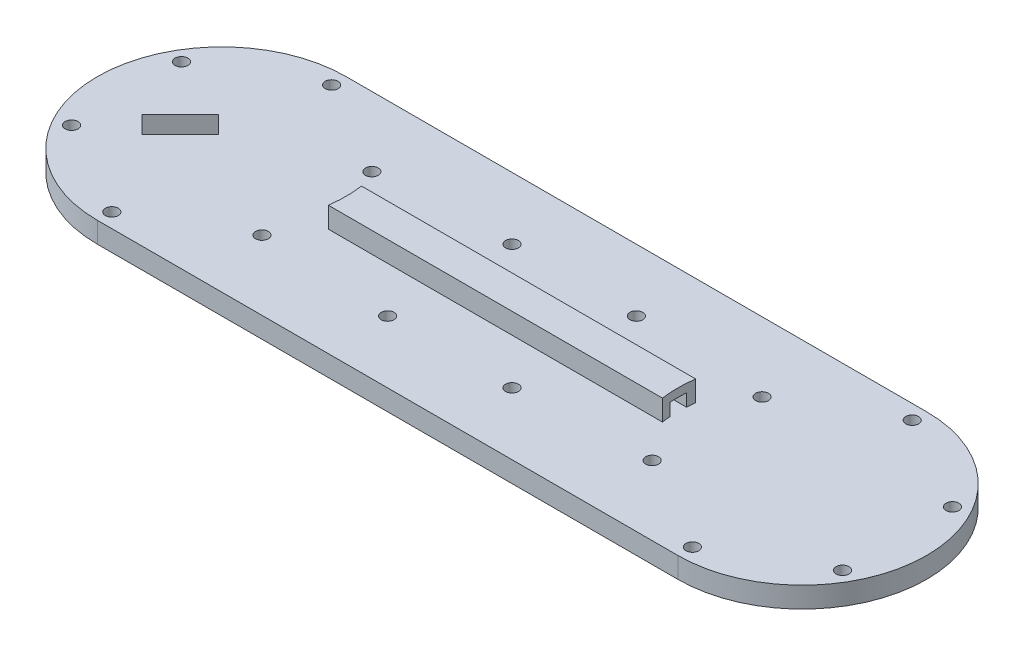
ISO-10303-21;
HEADER;
FILE_DESCRIPTION(('STEP AP214'),'2;1');
FILE_NAME('part.step','',(''),(''),'','','');
FILE_SCHEMA(('AUTOMOTIVE_DESIGN { 1 0 10303 214 1 1 1 1 }'));
ENDSEC;
DATA;
#1=APPLICATION_CONTEXT('core data for automotive mechanical design processes');
#2=APPLICATION_PROTOCOL_DEFINITION('international standard','automotive_design',2000,#1);
#3=PRODUCT_CONTEXT('',#1,'mechanical');
#4=PRODUCT('Part','Part','',(#3));
#5=PRODUCT_RELATED_PRODUCT_CATEGORY('part','',(#4));
#6=PRODUCT_DEFINITION_FORMATION('','',#4);
#7=PRODUCT_DEFINITION_CONTEXT('part definition',#1,'design');
#8=PRODUCT_DEFINITION('design','',#6,#7);
#9=PRODUCT_DEFINITION_SHAPE('','',#8);
#10=(LENGTH_UNIT() NAMED_UNIT(*) SI_UNIT(.MILLI.,.METRE.));
#11=(NAMED_UNIT(*) PLANE_ANGLE_UNIT() SI_UNIT($,.RADIAN.));
#12=(NAMED_UNIT(*) SI_UNIT($,.STERADIAN.) SOLID_ANGLE_UNIT());
#13=UNCERTAINTY_MEASURE_WITH_UNIT(LENGTH_MEASURE(1.E-05),#10,'distance_accuracy_value','');
#14=(GEOMETRIC_REPRESENTATION_CONTEXT(3) GLOBAL_UNCERTAINTY_ASSIGNED_CONTEXT((#13)) GLOBAL_UNIT_ASSIGNED_CONTEXT((#10,
#11,#12)) REPRESENTATION_CONTEXT('',''));
#15=CARTESIAN_POINT('',(0.,0.,0.));
#16=DIRECTION('',(0.,0.,1.));
#17=DIRECTION('',(1.,0.,0.));
#18=AXIS2_PLACEMENT_3D('',#15,#16,#17);
#19=CARTESIAN_POINT('',(70.,5.,0.));
#20=DIRECTION('',(0.,-1.,0.));
#21=DIRECTION('',(0.,0.,-1.));
#22=AXIS2_PLACEMENT_3D('',#19,#20,#21);
#23=PLANE('',#22);
#24=CARTESIAN_POINT('',(-15.,5.,15.));
#25=DIRECTION('',(0.,1.,0.));
#26=DIRECTION('',(0.,0.,1.));
#27=AXIS2_PLACEMENT_3D('',#24,#25,#26);
#28=CIRCLE('',#27,1.55);
#29=CARTESIAN_POINT('',(-15.,5.,16.55));
#30=VERTEX_POINT('',#29);
#31=EDGE_CURVE('E457',#30,#30,#28,.T.);
#32=ORIENTED_EDGE('',*,*,#31,.F.);
#33=EDGE_LOOP('',(#32));
#34=FACE_BOUND('',#33,.T.);
#35=CARTESIAN_POINT('',(-15.,5.,-15.));
#36=DIRECTION('',(0.,1.,0.));
#37=DIRECTION('',(0.,0.,1.));
#38=AXIS2_PLACEMENT_3D('',#35,#36,#37);
#39=CIRCLE('',#38,1.55);
#40=CARTESIAN_POINT('',(-15.,5.,-13.45));
#41=VERTEX_POINT('',#40);
#42=EDGE_CURVE('E463',#41,#41,#39,.T.);
#43=ORIENTED_EDGE('',*,*,#42,.F.);
#44=EDGE_LOOP('',(#43));
#45=FACE_BOUND('',#44,.T.);
#46=CARTESIAN_POINT('',(15.,5.,-15.));
#47=DIRECTION('',(0.,1.,0.));
#48=DIRECTION('',(0.,0.,1.));
#49=AXIS2_PLACEMENT_3D('',#46,#47,#48);
#50=CIRCLE('',#49,1.55);
#51=CARTESIAN_POINT('',(15.,5.,-13.45));
#52=VERTEX_POINT('',#51);
#53=EDGE_CURVE('E469',#52,#52,#50,.T.);
#54=ORIENTED_EDGE('',*,*,#53,.F.);
#55=EDGE_LOOP('',(#54));
#56=FACE_BOUND('',#55,.T.);
#57=CARTESIAN_POINT('',(15.,5.,15.));
#58=DIRECTION('',(0.,1.,0.));
#59=DIRECTION('',(0.,0.,1.));
#60=AXIS2_PLACEMENT_3D('',#57,#58,#59);
#61=CIRCLE('',#60,1.55);
#62=CARTESIAN_POINT('',(15.,5.,16.55));
#63=VERTEX_POINT('',#62);
#64=EDGE_CURVE('E475',#63,#63,#61,.T.);
#65=ORIENTED_EDGE('',*,*,#64,.F.);
#66=EDGE_LOOP('',(#65));
#67=FACE_BOUND('',#66,.T.);
#68=DIRECTION('',(1.,0.,0.));
#69=VECTOR('',#68,1.);
#70=CARTESIAN_POINT('',(-70.,5.,30.));
#71=LINE('',#70,#69);
#72=CARTESIAN_POINT('',(-70.,5.,30.));
#73=VERTEX_POINT('',#72);
#74=CARTESIAN_POINT('',(70.,5.,30.));
#75=VERTEX_POINT('',#74);
#76=EDGE_CURVE('E481',#73,#75,#71,.T.);
#77=ORIENTED_EDGE('',*,*,#76,.T.);
#78=CARTESIAN_POINT('',(70.,5.,0.));
#79=DIRECTION('',(0.,-1.,0.));
#80=DIRECTION('',(0.,0.,-1.));
#81=AXIS2_PLACEMENT_3D('',#78,#79,#80);
#82=CIRCLE('',#81,30.);
#83=CARTESIAN_POINT('',(70.,5.,-30.));
#84=VERTEX_POINT('',#83);
#85=EDGE_CURVE('E483',#84,#75,#82,.T.);
#86=ORIENTED_EDGE('',*,*,#85,.F.);
#87=DIRECTION('',(1.,0.,0.));
#88=VECTOR('',#87,1.);
#89=CARTESIAN_POINT('',(-70.,5.,-30.));
#90=LINE('',#89,#88);
#91=CARTESIAN_POINT('',(-70.,5.,-30.));
#92=VERTEX_POINT('',#91);
#93=EDGE_CURVE('E487',#92,#84,#90,.T.);
#94=ORIENTED_EDGE('',*,*,#93,.F.);
#95=CARTESIAN_POINT('',(-70.,5.,0.));
#96=DIRECTION('',(0.,-1.,0.));
#97=DIRECTION('',(0.,0.,-1.));
#98=AXIS2_PLACEMENT_3D('',#95,#96,#97);
#99=CIRCLE('',#98,30.);
#100=EDGE_CURVE('E490',#73,#92,#99,.T.);
#101=ORIENTED_EDGE('',*,*,#100,.F.);
#102=EDGE_LOOP('',(#77,#86,#94,#101));
#103=FACE_BOUND('',#102,.T.);
#104=CARTESIAN_POINT('',(-92.9496732002877,5.,-13.2499999999999));
#105=DIRECTION('',(0.,1.,0.));
#106=DIRECTION('',(0.,0.,1.));
#107=AXIS2_PLACEMENT_3D('',#104,#105,#106);
#108=CIRCLE('',#107,1.54999999999999);
#109=CARTESIAN_POINT('',(-92.9496732002877,5.,-11.6999999999999));
#110=VERTEX_POINT('',#109);
#111=EDGE_CURVE('E442',#110,#110,#108,.T.);
#112=ORIENTED_EDGE('',*,*,#111,.F.);
#113=EDGE_LOOP('',(#112));
#114=FACE_BOUND('',#113,.T.);
#115=CARTESIAN_POINT('',(70.,5.,-26.5));
#116=DIRECTION('',(0.,1.,0.));
#117=DIRECTION('',(0.,0.,1.));
#118=AXIS2_PLACEMENT_3D('',#115,#116,#117);
#119=CIRCLE('',#118,1.54999999999999);
#120=CARTESIAN_POINT('',(70.,5.,-24.95));
#121=VERTEX_POINT('',#120);
#122=EDGE_CURVE('E391',#121,#121,#119,.T.);
#123=ORIENTED_EDGE('',*,*,#122,.F.);
#124=EDGE_LOOP('',(#123));
#125=FACE_BOUND('',#124,.T.);
#126=CARTESIAN_POINT('',(-92.9496732002876,5.,13.2500000000001));
#127=DIRECTION('',(0.,1.,0.));
#128=DIRECTION('',(0.,0.,1.));
#129=AXIS2_PLACEMENT_3D('',#126,#127,#128);
#130=CIRCLE('',#129,1.54999999999999);
#131=CARTESIAN_POINT('',(-92.9496732002876,5.,14.8000000000001));
#132=VERTEX_POINT('',#131);
#133=EDGE_CURVE('E398',#132,#132,#130,.T.);
#134=ORIENTED_EDGE('',*,*,#133,.F.);
#135=EDGE_LOOP('',(#134));
#136=FACE_BOUND('',#135,.T.);
#137=CARTESIAN_POINT('',(-47.0503267997124,5.,-13.2500000000001));
#138=DIRECTION('',(0.,1.,0.));
#139=DIRECTION('',(0.,0.,1.));
#140=AXIS2_PLACEMENT_3D('',#137,#138,#139);
#141=CIRCLE('',#140,1.55);
#142=CARTESIAN_POINT('',(-47.0503267997124,5.,-11.7000000000001));
#143=VERTEX_POINT('',#142);
#144=EDGE_CURVE('E385',#143,#143,#141,.T.);
#145=ORIENTED_EDGE('',*,*,#144,.F.);
#146=EDGE_LOOP('',(#145));
#147=FACE_BOUND('',#146,.T.);
#148=CARTESIAN_POINT('',(47.0503267997124,5.,13.2500000000001));
#149=DIRECTION('',(0.,1.,0.));
#150=DIRECTION('',(0.,0.,1.));
#151=AXIS2_PLACEMENT_3D('',#148,#149,#150);
#152=CIRCLE('',#151,1.54999999999999);
#153=CARTESIAN_POINT('',(47.0503267997124,5.,14.8000000000001));
#154=VERTEX_POINT('',#153);
#155=EDGE_CURVE('E434',#154,#154,#152,.T.);
#156=ORIENTED_EDGE('',*,*,#155,.F.);
#157=EDGE_LOOP('',(#156));
#158=FACE_BOUND('',#157,.T.);
#159=CARTESIAN_POINT('',(-70.,5.,-26.5));
#160=DIRECTION('',(0.,1.,0.));
#161=DIRECTION('',(0.,0.,1.));
#162=AXIS2_PLACEMENT_3D('',#159,#160,#161);
#163=CIRCLE('',#162,1.54999999999999);
#164=CARTESIAN_POINT('',(-70.,5.,-24.95));
#165=VERTEX_POINT('',#164);
#166=EDGE_CURVE('E427',#165,#165,#163,.T.);
#167=ORIENTED_EDGE('',*,*,#166,.F.);
#168=EDGE_LOOP('',(#167));
#169=FACE_BOUND('',#168,.T.);
#170=CARTESIAN_POINT('',(-47.0503267997123,5.,13.2499999999999));
#171=DIRECTION('',(0.,1.,0.));
#172=DIRECTION('',(0.,0.,1.));
#173=AXIS2_PLACEMENT_3D('',#170,#171,#172);
#174=CIRCLE('',#173,1.55);
#175=CARTESIAN_POINT('',(-47.0503267997123,5.,14.7999999999999));
#176=VERTEX_POINT('',#175);
#177=EDGE_CURVE('E446',#176,#176,#174,.T.);
#178=ORIENTED_EDGE('',*,*,#177,.F.);
#179=EDGE_LOOP('',(#178));
#180=FACE_BOUND('',#179,.T.);
#181=CARTESIAN_POINT('',(-70.,5.,26.5));
#182=DIRECTION('',(0.,1.,0.));
#183=DIRECTION('',(0.,0.,1.));
#184=AXIS2_PLACEMENT_3D('',#181,#182,#183);
#185=CIRCLE('',#184,1.54999999999999);
#186=CARTESIAN_POINT('',(-70.,5.,28.05));
#187=VERTEX_POINT('',#186);
#188=EDGE_CURVE('E439',#187,#187,#185,.T.);
#189=ORIENTED_EDGE('',*,*,#188,.F.);
#190=EDGE_LOOP('',(#189));
#191=FACE_BOUND('',#190,.T.);
#192=CARTESIAN_POINT('',(47.0503267997123,5.,-13.2499999999999));
#193=DIRECTION('',(0.,1.,0.));
#194=DIRECTION('',(0.,0.,1.));
#195=AXIS2_PLACEMENT_3D('',#192,#193,#194);
#196=CIRCLE('',#195,1.54999999999999);
#197=CARTESIAN_POINT('',(47.0503267997123,5.,-11.6999999999999));
#198=VERTEX_POINT('',#197);
#199=EDGE_CURVE('E403',#198,#198,#196,.T.);
#200=ORIENTED_EDGE('',*,*,#199,.F.);
#201=EDGE_LOOP('',(#200));
#202=FACE_BOUND('',#201,.T.);
#203=CARTESIAN_POINT('',(92.9496732002876,5.,-13.2500000000001));
#204=DIRECTION('',(0.,1.,0.));
#205=DIRECTION('',(0.,0.,1.));
#206=AXIS2_PLACEMENT_3D('',#203,#204,#205);
#207=CIRCLE('',#206,1.55000000000001);
#208=CARTESIAN_POINT('',(92.9496732002876,5.,-11.7000000000001));
#209=VERTEX_POINT('',#208);
#210=EDGE_CURVE('E410',#209,#209,#207,.T.);
#211=ORIENTED_EDGE('',*,*,#210,.F.);
#212=EDGE_LOOP('',(#211));
#213=FACE_BOUND('',#212,.T.);
#214=CARTESIAN_POINT('',(92.9496732002877,5.,13.2499999999999));
#215=DIRECTION('',(0.,1.,0.));
#216=DIRECTION('',(0.,0.,1.));
#217=AXIS2_PLACEMENT_3D('',#214,#215,#216);
#218=CIRCLE('',#217,1.55000000000001);
#219=CARTESIAN_POINT('',(92.9496732002877,5.,14.7999999999999));
#220=VERTEX_POINT('',#219);
#221=EDGE_CURVE('E416',#220,#220,#218,.T.);
#222=ORIENTED_EDGE('',*,*,#221,.F.);
#223=EDGE_LOOP('',(#222));
#224=FACE_BOUND('',#223,.T.);
#225=CARTESIAN_POINT('',(70.,5.,26.5));
#226=DIRECTION('',(0.,1.,0.));
#227=DIRECTION('',(0.,0.,1.));
#228=AXIS2_PLACEMENT_3D('',#225,#226,#227);
#229=CIRCLE('',#228,1.54999999999999);
#230=CARTESIAN_POINT('',(70.,5.,28.05));
#231=VERTEX_POINT('',#230);
#232=EDGE_CURVE('E422',#231,#231,#229,.T.);
#233=ORIENTED_EDGE('',*,*,#232,.F.);
#234=EDGE_LOOP('',(#233));
#235=FACE_BOUND('',#234,.T.);
#236=DIRECTION('',(1.,0.,0.));
#237=VECTOR('',#236,1.);
#238=CARTESIAN_POINT('',(-80.,5.,2.));
#239=LINE('',#238,#237);
#240=CARTESIAN_POINT('',(-40.0667409058085,5.,2.));
#241=VERTEX_POINT('',#240);
#242=CARTESIAN_POINT('',(40.0667409058085,5.,2.));
#243=VERTEX_POINT('',#242);
#244=EDGE_CURVE('E328',#241,#243,#239,.T.);
#245=ORIENTED_EDGE('',*,*,#244,.T.);
#246=CARTESIAN_POINT('',(70.,5.,0.));
#247=DIRECTION('',(0.,1.,0.));
#248=DIRECTION('',(0.,0.,1.));
#249=AXIS2_PLACEMENT_3D('',#246,#247,#248);
#250=CIRCLE('',#249,30.);
#251=CARTESIAN_POINT('',(40.267862505363,5.,3.99999999999999));
#252=VERTEX_POINT('',#251);
#253=EDGE_CURVE('E349',#243,#252,#250,.T.);
#254=ORIENTED_EDGE('',*,*,#253,.T.);
#255=DIRECTION('',(-1.,0.,0.));
#256=VECTOR('',#255,1.);
#257=CARTESIAN_POINT('',(0.,5.,4.));
#258=LINE('',#257,#256);
#259=CARTESIAN_POINT('',(-40.267862505363,5.,4.));
#260=VERTEX_POINT('',#259);
#261=EDGE_CURVE('E353',#252,#260,#258,.T.);
#262=ORIENTED_EDGE('',*,*,#261,.T.);
#263=CARTESIAN_POINT('',(-70.,5.,0.));
#264=DIRECTION('',(0.,-1.,0.));
#265=DIRECTION('',(0.,0.,-1.));
#266=AXIS2_PLACEMENT_3D('',#263,#264,#265);
#267=CIRCLE('',#266,30.);
#268=EDGE_CURVE('E368',#241,#260,#267,.T.);
#269=ORIENTED_EDGE('',*,*,#268,.F.);
#270=EDGE_LOOP('',(#245,#254,#262,#269));
#271=FACE_BOUND('',#270,.T.);
#272=CARTESIAN_POINT('',(40.267862505363,5.,-3.99999999999999));
#273=VERTEX_POINT('',#272);
#274=CARTESIAN_POINT('',(40.0667409058085,5.,-2.));
#275=VERTEX_POINT('',#274);
#276=EDGE_CURVE('E363',#273,#275,#250,.T.);
#277=ORIENTED_EDGE('',*,*,#276,.T.);
#278=DIRECTION('',(1.,0.,0.));
#279=VECTOR('',#278,1.);
#280=CARTESIAN_POINT('',(-80.,5.,-2.));
#281=LINE('',#280,#279);
#282=CARTESIAN_POINT('',(-40.0667409058085,5.,-2.));
#283=VERTEX_POINT('',#282);
#284=EDGE_CURVE('E325',#283,#275,#281,.T.);
#285=ORIENTED_EDGE('',*,*,#284,.F.);
#286=CARTESIAN_POINT('',(-40.267862505363,5.,-3.99999999999999));
#287=VERTEX_POINT('',#286);
#288=EDGE_CURVE('E369',#287,#283,#267,.T.);
#289=ORIENTED_EDGE('',*,*,#288,.F.);
#290=DIRECTION('',(-1.,0.,0.));
#291=VECTOR('',#290,1.);
#292=CARTESIAN_POINT('',(0.,5.,-3.99999999999999));
#293=LINE('',#292,#291);
#294=EDGE_CURVE('E366',#273,#287,#293,.T.);
#295=ORIENTED_EDGE('',*,*,#294,.F.);
#296=EDGE_LOOP('',(#277,#285,#289,#295));
#297=FACE_BOUND('',#296,.T.);
#298=DIRECTION('',(0.707106781186547,0.,-0.707106781186548));
#299=VECTOR('',#298,1.);
#300=CARTESIAN_POINT('',(-2.87867965644037,5.,-72.8786796564404));
#301=LINE('',#300,#299);
#302=CARTESIAN_POINT('',(-82.4748737341529,5.,6.7175144212722));
#303=VERTEX_POINT('',#302);
#304=CARTESIAN_POINT('',(-73.2824855787278,5.,-2.47487373415291));
#305=VERTEX_POINT('',#304);
#306=EDGE_CURVE('E322',#303,#305,#301,.T.);
#307=ORIENTED_EDGE('',*,*,#306,.F.);
#308=DIRECTION('',(-0.707106781186556,0.,-0.707106781186539));
#309=VECTOR('',#308,1.);
#310=CARTESIAN_POINT('',(-9.59619407771078,5.,79.5961940777126));
#311=LINE('',#310,#309);
#312=CARTESIAN_POINT('',(-86.7175144212722,5.,2.47487373415298));
#313=VERTEX_POINT('',#312);
#314=EDGE_CURVE('E314',#303,#313,#311,.T.);
#315=ORIENTED_EDGE('',*,*,#314,.T.);
#316=DIRECTION('',(0.707106781186547,0.,-0.707106781186549));
#317=VECTOR('',#316,1.);
#318=CARTESIAN_POINT('',(-7.12132034355986,5.,-77.1213203435596));
#319=LINE('',#318,#317);
#320=CARTESIAN_POINT('',(-77.5251262658471,5.,-6.7175144212722));
#321=VERTEX_POINT('',#320);
#322=EDGE_CURVE('E295',#313,#321,#319,.T.);
#323=ORIENTED_EDGE('',*,*,#322,.T.);
#324=DIRECTION('',(0.707106781186548,0.,0.707106781186547));
#325=VECTOR('',#324,1.);
#326=CARTESIAN_POINT('',(-0.403805922287392,5.,70.4038059222874));
#327=LINE('',#326,#325);
#328=EDGE_CURVE('E319',#321,#305,#327,.T.);
#329=ORIENTED_EDGE('',*,*,#328,.T.);
#330=EDGE_LOOP('',(#307,#315,#323,#329));
#331=FACE_BOUND('',#330,.T.);
#332=ADVANCED_FACE('F177',(#34,#45,#56,#67,#103,#114,#125,#136,#147,#158,#169,#180,#191,#202,
#213,#224,#235,#271,#297,#331),#23,.F.);
#333=CARTESIAN_POINT('',(70.,0.,0.));
#334=DIRECTION('',(0.,-1.,0.));
#335=DIRECTION('',(0.,0.,-1.));
#336=AXIS2_PLACEMENT_3D('',#333,#334,#335);
#337=PLANE('',#336);
#338=CARTESIAN_POINT('',(70.,0.,26.5));
#339=DIRECTION('',(0.,1.,0.));
#340=DIRECTION('',(0.,0.,1.));
#341=AXIS2_PLACEMENT_3D('',#338,#339,#340);
#342=CIRCLE('',#341,1.54999999999999);
#343=CARTESIAN_POINT('',(70.,0.,28.05));
#344=VERTEX_POINT('',#343);
#345=EDGE_CURVE('E394',#344,#344,#342,.T.);
#346=ORIENTED_EDGE('',*,*,#345,.T.);
#347=EDGE_LOOP('',(#346));
#348=FACE_BOUND('',#347,.T.);
#349=CARTESIAN_POINT('',(92.9496732002877,0.,13.2499999999999));
#350=DIRECTION('',(0.,1.,0.));
#351=DIRECTION('',(0.,0.,1.));
#352=AXIS2_PLACEMENT_3D('',#349,#350,#351);
#353=CIRCLE('',#352,1.55000000000001);
#354=CARTESIAN_POINT('',(92.9496732002877,0.,14.7999999999999));
#355=VERTEX_POINT('',#354);
#356=EDGE_CURVE('E419',#355,#355,#353,.T.);
#357=ORIENTED_EDGE('',*,*,#356,.T.);
#358=EDGE_LOOP('',(#357));
#359=FACE_BOUND('',#358,.T.);
#360=CARTESIAN_POINT('',(92.9496732002876,0.,-13.2500000000001));
#361=DIRECTION('',(0.,1.,0.));
#362=DIRECTION('',(0.,0.,1.));
#363=AXIS2_PLACEMENT_3D('',#360,#361,#362);
#364=CIRCLE('',#363,1.55000000000001);
#365=CARTESIAN_POINT('',(92.9496732002876,0.,-11.7000000000001));
#366=VERTEX_POINT('',#365);
#367=EDGE_CURVE('E413',#366,#366,#364,.T.);
#368=ORIENTED_EDGE('',*,*,#367,.T.);
#369=EDGE_LOOP('',(#368));
#370=FACE_BOUND('',#369,.T.);
#371=CARTESIAN_POINT('',(47.0503267997123,0.,-13.2499999999999));
#372=DIRECTION('',(0.,1.,0.));
#373=DIRECTION('',(0.,0.,1.));
#374=AXIS2_PLACEMENT_3D('',#371,#372,#373);
#375=CIRCLE('',#374,1.54999999999999);
#376=CARTESIAN_POINT('',(47.0503267997123,0.,-11.6999999999999));
#377=VERTEX_POINT('',#376);
#378=EDGE_CURVE('E407',#377,#377,#375,.T.);
#379=ORIENTED_EDGE('',*,*,#378,.T.);
#380=EDGE_LOOP('',(#379));
#381=FACE_BOUND('',#380,.T.);
#382=CARTESIAN_POINT('',(-70.,0.,26.5));
#383=DIRECTION('',(0.,1.,0.));
#384=DIRECTION('',(0.,0.,1.));
#385=AXIS2_PLACEMENT_3D('',#382,#383,#384);
#386=CIRCLE('',#385,1.54999999999999);
#387=CARTESIAN_POINT('',(-70.,0.,28.05));
#388=VERTEX_POINT('',#387);
#389=EDGE_CURVE('E443',#388,#388,#386,.T.);
#390=ORIENTED_EDGE('',*,*,#389,.T.);
#391=EDGE_LOOP('',(#390));
#392=FACE_BOUND('',#391,.T.);
#393=CARTESIAN_POINT('',(-47.0503267997123,0.,13.2499999999999));
#394=DIRECTION('',(0.,1.,0.));
#395=DIRECTION('',(0.,0.,1.));
#396=AXIS2_PLACEMENT_3D('',#393,#394,#395);
#397=CIRCLE('',#396,1.55);
#398=CARTESIAN_POINT('',(-47.0503267997123,0.,14.7999999999999));
#399=VERTEX_POINT('',#398);
#400=EDGE_CURVE('E430',#399,#399,#397,.T.);
#401=ORIENTED_EDGE('',*,*,#400,.T.);
#402=EDGE_LOOP('',(#401));
#403=FACE_BOUND('',#402,.T.);
#404=CARTESIAN_POINT('',(-70.,0.,-26.5));
#405=DIRECTION('',(0.,1.,0.));
#406=DIRECTION('',(0.,0.,1.));
#407=AXIS2_PLACEMENT_3D('',#404,#405,#406);
#408=CIRCLE('',#407,1.54999999999999);
#409=CARTESIAN_POINT('',(-70.,0.,-24.95));
#410=VERTEX_POINT('',#409);
#411=EDGE_CURVE('E431',#410,#410,#408,.T.);
#412=ORIENTED_EDGE('',*,*,#411,.T.);
#413=EDGE_LOOP('',(#412));
#414=FACE_BOUND('',#413,.T.);
#415=CARTESIAN_POINT('',(47.0503267997124,0.,13.2500000000001));
#416=DIRECTION('',(0.,1.,0.));
#417=DIRECTION('',(0.,0.,1.));
#418=AXIS2_PLACEMENT_3D('',#415,#416,#417);
#419=CIRCLE('',#418,1.54999999999999);
#420=CARTESIAN_POINT('',(47.0503267997124,0.,14.8000000000001));
#421=VERTEX_POINT('',#420);
#422=EDGE_CURVE('E406',#421,#421,#419,.T.);
#423=ORIENTED_EDGE('',*,*,#422,.T.);
#424=EDGE_LOOP('',(#423));
#425=FACE_BOUND('',#424,.T.);
#426=CARTESIAN_POINT('',(-47.0503267997124,0.,-13.2500000000001));
#427=DIRECTION('',(0.,1.,0.));
#428=DIRECTION('',(0.,0.,1.));
#429=AXIS2_PLACEMENT_3D('',#426,#427,#428);
#430=CIRCLE('',#429,1.55);
#431=CARTESIAN_POINT('',(-47.0503267997124,0.,-11.7000000000001));
#432=VERTEX_POINT('',#431);
#433=EDGE_CURVE('E384',#432,#432,#430,.T.);
#434=ORIENTED_EDGE('',*,*,#433,.T.);
#435=EDGE_LOOP('',(#434));
#436=FACE_BOUND('',#435,.T.);
#437=CARTESIAN_POINT('',(-92.9496732002876,0.,13.2500000000001));
#438=DIRECTION('',(0.,1.,0.));
#439=DIRECTION('',(0.,0.,1.));
#440=AXIS2_PLACEMENT_3D('',#437,#438,#439);
#441=CIRCLE('',#440,1.54999999999999);
#442=CARTESIAN_POINT('',(-92.9496732002876,0.,14.8000000000001));
#443=VERTEX_POINT('',#442);
#444=EDGE_CURVE('E388',#443,#443,#441,.T.);
#445=ORIENTED_EDGE('',*,*,#444,.T.);
#446=EDGE_LOOP('',(#445));
#447=FACE_BOUND('',#446,.T.);
#448=CARTESIAN_POINT('',(70.,0.,-26.5));
#449=DIRECTION('',(0.,1.,0.));
#450=DIRECTION('',(0.,0.,1.));
#451=AXIS2_PLACEMENT_3D('',#448,#449,#450);
#452=CIRCLE('',#451,1.54999999999999);
#453=CARTESIAN_POINT('',(70.,0.,-24.95));
#454=VERTEX_POINT('',#453);
#455=EDGE_CURVE('E395',#454,#454,#452,.T.);
#456=ORIENTED_EDGE('',*,*,#455,.T.);
#457=EDGE_LOOP('',(#456));
#458=FACE_BOUND('',#457,.T.);
#459=CARTESIAN_POINT('',(-92.9496732002877,0.,-13.2499999999999));
#460=DIRECTION('',(0.,1.,0.));
#461=DIRECTION('',(0.,0.,1.));
#462=AXIS2_PLACEMENT_3D('',#459,#460,#461);
#463=CIRCLE('',#462,1.54999999999999);
#464=CARTESIAN_POINT('',(-92.9496732002877,0.,-11.6999999999999));
#465=VERTEX_POINT('',#464);
#466=EDGE_CURVE('E451',#465,#465,#463,.T.);
#467=ORIENTED_EDGE('',*,*,#466,.T.);
#468=EDGE_LOOP('',(#467));
#469=FACE_BOUND('',#468,.T.);
#470=CARTESIAN_POINT('',(-15.,0.,-15.));
#471=DIRECTION('',(0.,1.,0.));
#472=DIRECTION('',(0.,0.,1.));
#473=AXIS2_PLACEMENT_3D('',#470,#471,#472);
#474=CIRCLE('',#473,1.55);
#475=CARTESIAN_POINT('',(-15.,0.,-13.45));
#476=VERTEX_POINT('',#475);
#477=EDGE_CURVE('E460',#476,#476,#474,.T.);
#478=ORIENTED_EDGE('',*,*,#477,.T.);
#479=EDGE_LOOP('',(#478));
#480=FACE_BOUND('',#479,.T.);
#481=CARTESIAN_POINT('',(15.,0.,15.));
#482=DIRECTION('',(0.,1.,0.));
#483=DIRECTION('',(0.,0.,1.));
#484=AXIS2_PLACEMENT_3D('',#481,#482,#483);
#485=CIRCLE('',#484,1.55);
#486=CARTESIAN_POINT('',(15.,0.,16.55));
#487=VERTEX_POINT('',#486);
#488=EDGE_CURVE('E472',#487,#487,#485,.T.);
#489=ORIENTED_EDGE('',*,*,#488,.T.);
#490=EDGE_LOOP('',(#489));
#491=FACE_BOUND('',#490,.T.);
#492=DIRECTION('',(1.,0.,0.));
#493=VECTOR('',#492,1.);
#494=CARTESIAN_POINT('',(-70.,0.,30.));
#495=LINE('',#494,#493);
#496=CARTESIAN_POINT('',(-70.,0.,30.));
#497=VERTEX_POINT('',#496);
#498=CARTESIAN_POINT('',(70.,0.,30.));
#499=VERTEX_POINT('',#498);
#500=EDGE_CURVE('E478',#497,#499,#495,.T.);
#501=ORIENTED_EDGE('',*,*,#500,.F.);
#502=CARTESIAN_POINT('',(-70.,0.,0.));
#503=DIRECTION('',(0.,-1.,0.));
#504=DIRECTION('',(0.,0.,-1.));
#505=AXIS2_PLACEMENT_3D('',#502,#503,#504);
#506=CIRCLE('',#505,30.);
#507=CARTESIAN_POINT('',(-70.,0.,-30.));
#508=VERTEX_POINT('',#507);
#509=EDGE_CURVE('E484',#497,#508,#506,.T.);
#510=ORIENTED_EDGE('',*,*,#509,.T.);
#511=DIRECTION('',(1.,0.,0.));
#512=VECTOR('',#511,1.);
#513=CARTESIAN_POINT('',(-70.,0.,-30.));
#514=LINE('',#513,#512);
#515=CARTESIAN_POINT('',(70.,0.,-30.));
#516=VERTEX_POINT('',#515);
#517=EDGE_CURVE('E499',#508,#516,#514,.T.);
#518=ORIENTED_EDGE('',*,*,#517,.T.);
#519=CARTESIAN_POINT('',(70.,0.,0.));
#520=DIRECTION('',(0.,-1.,0.));
#521=DIRECTION('',(0.,0.,-1.));
#522=AXIS2_PLACEMENT_3D('',#519,#520,#521);
#523=CIRCLE('',#522,30.);
#524=EDGE_CURVE('E496',#516,#499,#523,.T.);
#525=ORIENTED_EDGE('',*,*,#524,.T.);
#526=EDGE_LOOP('',(#501,#510,#518,#525));
#527=FACE_BOUND('',#526,.T.);
#528=CARTESIAN_POINT('',(15.,0.,-15.));
#529=DIRECTION('',(0.,1.,0.));
#530=DIRECTION('',(0.,0.,1.));
#531=AXIS2_PLACEMENT_3D('',#528,#529,#530);
#532=CIRCLE('',#531,1.55);
#533=CARTESIAN_POINT('',(15.,0.,-13.45));
#534=VERTEX_POINT('',#533);
#535=EDGE_CURVE('E466',#534,#534,#532,.T.);
#536=ORIENTED_EDGE('',*,*,#535,.T.);
#537=EDGE_LOOP('',(#536));
#538=FACE_BOUND('',#537,.T.);
#539=CARTESIAN_POINT('',(-15.,0.,15.));
#540=DIRECTION('',(0.,1.,0.));
#541=DIRECTION('',(0.,0.,1.));
#542=AXIS2_PLACEMENT_3D('',#539,#540,#541);
#543=CIRCLE('',#542,1.55);
#544=CARTESIAN_POINT('',(-15.,0.,16.55));
#545=VERTEX_POINT('',#544);
#546=EDGE_CURVE('E454',#545,#545,#543,.T.);
#547=ORIENTED_EDGE('',*,*,#546,.T.);
#548=EDGE_LOOP('',(#547));
#549=FACE_BOUND('',#548,.T.);
#550=DIRECTION('',(-0.707106781186556,0.,-0.707106781186539));
#551=VECTOR('',#550,1.);
#552=CARTESIAN_POINT('',(-82.4748737341529,0.,6.7175144212722));
#553=LINE('',#552,#551);
#554=CARTESIAN_POINT('',(-82.4748737341529,0.,6.71751442127221));
#555=VERTEX_POINT('',#554);
#556=CARTESIAN_POINT('',(-86.7175144212722,0.,2.47487373415296));
#557=VERTEX_POINT('',#556);
#558=EDGE_CURVE('E301',#555,#557,#553,.T.);
#559=ORIENTED_EDGE('',*,*,#558,.F.);
#560=DIRECTION('',(0.707106781186547,0.,-0.707106781186548));
#561=VECTOR('',#560,1.);
#562=CARTESIAN_POINT('',(-77.8786796564403,0.,2.12132034355964));
#563=LINE('',#562,#561);
#564=CARTESIAN_POINT('',(-73.2824855787278,0.,-2.47487373415291));
#565=VERTEX_POINT('',#564);
#566=EDGE_CURVE('E200',#555,#565,#563,.T.);
#567=ORIENTED_EDGE('',*,*,#566,.T.);
#568=DIRECTION('',(0.707106781186548,0.,0.707106781186547));
#569=VECTOR('',#568,1.);
#570=CARTESIAN_POINT('',(-77.5251262658471,0.,-6.7175144212722));
#571=LINE('',#570,#569);
#572=CARTESIAN_POINT('',(-77.5251262658471,0.,-6.7175144212722));
#573=VERTEX_POINT('',#572);
#574=EDGE_CURVE('E307',#573,#565,#571,.T.);
#575=ORIENTED_EDGE('',*,*,#574,.F.);
#576=DIRECTION('',(0.707106781186547,0.,-0.707106781186549));
#577=VECTOR('',#576,1.);
#578=CARTESIAN_POINT('',(-82.1213203435596,0.,-2.12132034355965));
#579=LINE('',#578,#577);
#580=EDGE_CURVE('E292',#557,#573,#579,.T.);
#581=ORIENTED_EDGE('',*,*,#580,.F.);
#582=EDGE_LOOP('',(#559,#567,#575,#581));
#583=FACE_BOUND('',#582,.T.);
#584=ADVANCED_FACE('F305',(#348,#359,#370,#381,#392,#403,#414,#425,#436,#447,#458,#469,#480,
#491,#527,#538,#549,#583),#337,.T.);
#585=CARTESIAN_POINT('',(70.,10.,0.));
#586=DIRECTION('',(0.,-1.,0.));
#587=DIRECTION('',(0.,0.,-1.));
#588=AXIS2_PLACEMENT_3D('',#585,#586,#587);
#589=CYLINDRICAL_SURFACE('',#588,30.);
#590=CARTESIAN_POINT('',(70.,8.,0.));
#591=DIRECTION('',(0.,-1.,0.));
#592=DIRECTION('',(0.,0.,-1.));
#593=AXIS2_PLACEMENT_3D('',#590,#591,#592);
#594=CIRCLE('',#593,30.);
#595=CARTESIAN_POINT('',(40.0667409058085,8.,2.));
#596=VERTEX_POINT('',#595);
#597=CARTESIAN_POINT('',(40.0667409058085,8.,-2.));
#598=VERTEX_POINT('',#597);
#599=EDGE_CURVE('E341',#596,#598,#594,.T.);
#600=ORIENTED_EDGE('',*,*,#599,.T.);
#601=DIRECTION('',(0.,-1.,0.));
#602=VECTOR('',#601,1.);
#603=CARTESIAN_POINT('',(40.0667409058085,10.,-2.));
#604=LINE('',#603,#602);
#605=EDGE_CURVE('E346',#598,#275,#604,.T.);
#606=ORIENTED_EDGE('',*,*,#605,.T.);
#607=ORIENTED_EDGE('',*,*,#276,.F.);
#608=DIRECTION('',(0.,-1.,0.));
#609=VECTOR('',#608,1.);
#610=CARTESIAN_POINT('',(40.267862505363,10.,-3.99999999999999));
#611=LINE('',#610,#609);
#612=CARTESIAN_POINT('',(40.267862505363,10.,-3.99999999999999));
#613=VERTEX_POINT('',#612);
#614=EDGE_CURVE('E379',#613,#273,#611,.T.);
#615=ORIENTED_EDGE('',*,*,#614,.F.);
#616=CARTESIAN_POINT('',(70.,10.,0.));
#617=DIRECTION('',(0.,1.,0.));
#618=DIRECTION('',(0.,0.,1.));
#619=AXIS2_PLACEMENT_3D('',#616,#617,#618);
#620=CIRCLE('',#619,30.);
#621=CARTESIAN_POINT('',(40.267862505363,10.,3.99999999999999));
#622=VERTEX_POINT('',#621);
#623=EDGE_CURVE('E352',#613,#622,#620,.T.);
#624=ORIENTED_EDGE('',*,*,#623,.T.);
#625=DIRECTION('',(0.,-1.,0.));
#626=VECTOR('',#625,1.);
#627=CARTESIAN_POINT('',(40.267862505363,10.,3.99999999999999));
#628=LINE('',#627,#626);
#629=EDGE_CURVE('E381',#622,#252,#628,.T.);
#630=ORIENTED_EDGE('',*,*,#629,.T.);
#631=ORIENTED_EDGE('',*,*,#253,.F.);
#632=DIRECTION('',(0.,-1.,0.));
#633=VECTOR('',#632,1.);
#634=CARTESIAN_POINT('',(40.0667409058085,10.,2.));
#635=LINE('',#634,#633);
#636=EDGE_CURVE('E337',#596,#243,#635,.T.);
#637=ORIENTED_EDGE('',*,*,#636,.F.);
#638=EDGE_LOOP('',(#600,#606,#607,#615,#624,#630,#631,#637));
#639=FACE_BOUND('',#638,.T.);
#640=ADVANCED_FACE('F532',(#639),#589,.F.);
#641=CARTESIAN_POINT('',(-70.,10.,0.));
#642=DIRECTION('',(0.,-1.,0.));
#643=DIRECTION('',(0.,0.,-1.));
#644=AXIS2_PLACEMENT_3D('',#641,#642,#643);
#645=CYLINDRICAL_SURFACE('',#644,30.);
#646=DIRECTION('',(0.,-1.,0.));
#647=VECTOR('',#646,1.);
#648=CARTESIAN_POINT('',(-40.0667409058085,10.,-2.));
#649=LINE('',#648,#647);
#650=CARTESIAN_POINT('',(-40.0667409058085,8.,-2.));
#651=VERTEX_POINT('',#650);
#652=EDGE_CURVE('E344',#651,#283,#649,.T.);
#653=ORIENTED_EDGE('',*,*,#652,.F.);
#654=CARTESIAN_POINT('',(-70.,8.,0.));
#655=DIRECTION('',(0.,-1.,0.));
#656=DIRECTION('',(0.,0.,-1.));
#657=AXIS2_PLACEMENT_3D('',#654,#655,#656);
#658=CIRCLE('',#657,30.);
#659=CARTESIAN_POINT('',(-40.0667409058085,8.,2.));
#660=VERTEX_POINT('',#659);
#661=EDGE_CURVE('E339',#660,#651,#658,.F.);
#662=ORIENTED_EDGE('',*,*,#661,.F.);
#663=DIRECTION('',(0.,-1.,0.));
#664=VECTOR('',#663,1.);
#665=CARTESIAN_POINT('',(-40.0667409058085,10.,2.));
#666=LINE('',#665,#664);
#667=EDGE_CURVE('E327',#660,#241,#666,.T.);
#668=ORIENTED_EDGE('',*,*,#667,.T.);
#669=ORIENTED_EDGE('',*,*,#268,.T.);
#670=DIRECTION('',(0.,-1.,0.));
#671=VECTOR('',#670,1.);
#672=CARTESIAN_POINT('',(-40.267862505363,10.,4.));
#673=LINE('',#672,#671);
#674=CARTESIAN_POINT('',(-40.267862505363,10.,4.));
#675=VERTEX_POINT('',#674);
#676=EDGE_CURVE('E362',#675,#260,#673,.T.);
#677=ORIENTED_EDGE('',*,*,#676,.F.);
#678=CARTESIAN_POINT('',(-70.,10.,0.));
#679=DIRECTION('',(0.,-1.,0.));
#680=DIRECTION('',(0.,0.,-1.));
#681=AXIS2_PLACEMENT_3D('',#678,#679,#680);
#682=CIRCLE('',#681,30.);
#683=CARTESIAN_POINT('',(-40.267862505363,10.,-3.99999999999999));
#684=VERTEX_POINT('',#683);
#685=EDGE_CURVE('E359',#684,#675,#682,.T.);
#686=ORIENTED_EDGE('',*,*,#685,.F.);
#687=DIRECTION('',(0.,-1.,0.));
#688=VECTOR('',#687,1.);
#689=CARTESIAN_POINT('',(-40.267862505363,10.,-3.99999999999999));
#690=LINE('',#689,#688);
#691=EDGE_CURVE('E376',#684,#287,#690,.T.);
#692=ORIENTED_EDGE('',*,*,#691,.T.);
#693=ORIENTED_EDGE('',*,*,#288,.T.);
#694=EDGE_LOOP('',(#653,#662,#668,#669,#677,#686,#692,#693));
#695=FACE_BOUND('',#694,.T.);
#696=ADVANCED_FACE('F527',(#695),#645,.F.);
#697=CARTESIAN_POINT('',(-70.,5.,30.));
#698=DIRECTION('',(0.,0.,-1.));
#699=DIRECTION('',(-1.,0.,0.));
#700=AXIS2_PLACEMENT_3D('',#697,#698,#699);
#701=PLANE('',#700);
#702=ORIENTED_EDGE('',*,*,#500,.T.);
#703=DIRECTION('',(0.,-1.,0.));
#704=VECTOR('',#703,1.);
#705=CARTESIAN_POINT('',(70.,5.,30.));
#706=LINE('',#705,#704);
#707=EDGE_CURVE('E12',#75,#499,#706,.T.);
#708=ORIENTED_EDGE('',*,*,#707,.F.);
#709=ORIENTED_EDGE('',*,*,#76,.F.);
#710=DIRECTION('',(0.,-1.,0.));
#711=VECTOR('',#710,1.);
#712=CARTESIAN_POINT('',(-70.,5.,30.));
#713=LINE('',#712,#711);
#714=EDGE_CURVE('E493',#73,#497,#713,.T.);
#715=ORIENTED_EDGE('',*,*,#714,.T.);
#716=EDGE_LOOP('',(#702,#708,#709,#715));
#717=FACE_BOUND('',#716,.T.);
#718=ADVANCED_FACE('F179',(#717),#701,.F.);
#719=CARTESIAN_POINT('',(70.,5.,0.));
#720=DIRECTION('',(0.,-1.,0.));
#721=DIRECTION('',(0.,0.,-1.));
#722=AXIS2_PLACEMENT_3D('',#719,#720,#721);
#723=CYLINDRICAL_SURFACE('',#722,30.);
#724=ORIENTED_EDGE('',*,*,#524,.F.);
#725=DIRECTION('',(0.,-1.,0.));
#726=VECTOR('',#725,1.);
#727=CARTESIAN_POINT('',(70.,5.,-30.));
#728=LINE('',#727,#726);
#729=EDGE_CURVE('E185',#84,#516,#728,.T.);
#730=ORIENTED_EDGE('',*,*,#729,.F.);
#731=ORIENTED_EDGE('',*,*,#85,.T.);
#732=ORIENTED_EDGE('',*,*,#707,.T.);
#733=EDGE_LOOP('',(#724,#730,#731,#732));
#734=FACE_BOUND('',#733,.T.);
#735=ADVANCED_FACE('F513',(#734),#723,.T.);
#736=CARTESIAN_POINT('',(-70.,5.,-30.));
#737=DIRECTION('',(0.,0.,-1.));
#738=DIRECTION('',(-1.,0.,0.));
#739=AXIS2_PLACEMENT_3D('',#736,#737,#738);
#740=PLANE('',#739);
#741=ORIENTED_EDGE('',*,*,#517,.F.);
#742=DIRECTION('',(0.,-1.,0.));
#743=VECTOR('',#742,1.);
#744=CARTESIAN_POINT('',(-70.,5.,-30.));
#745=LINE('',#744,#743);
#746=EDGE_CURVE('E505',#92,#508,#745,.T.);
#747=ORIENTED_EDGE('',*,*,#746,.F.);
#748=ORIENTED_EDGE('',*,*,#93,.T.);
#749=ORIENTED_EDGE('',*,*,#729,.T.);
#750=EDGE_LOOP('',(#741,#747,#748,#749));
#751=FACE_BOUND('',#750,.T.);
#752=ADVANCED_FACE('F509',(#751),#740,.T.);
#753=CARTESIAN_POINT('',(-70.,5.,0.));
#754=DIRECTION('',(0.,-1.,0.));
#755=DIRECTION('',(0.,0.,-1.));
#756=AXIS2_PLACEMENT_3D('',#753,#754,#755);
#757=CYLINDRICAL_SURFACE('',#756,30.);
#758=ORIENTED_EDGE('',*,*,#509,.F.);
#759=ORIENTED_EDGE('',*,*,#714,.F.);
#760=ORIENTED_EDGE('',*,*,#100,.T.);
#761=ORIENTED_EDGE('',*,*,#746,.T.);
#762=EDGE_LOOP('',(#758,#759,#760,#761));
#763=FACE_BOUND('',#762,.T.);
#764=ADVANCED_FACE('F520',(#763),#757,.T.);
#765=CARTESIAN_POINT('',(15.,5.,15.));
#766=DIRECTION('',(0.,-1.,0.));
#767=DIRECTION('',(0.,0.,-1.));
#768=AXIS2_PLACEMENT_3D('',#765,#766,#767);
#769=CYLINDRICAL_SURFACE('',#768,1.55);
#770=ORIENTED_EDGE('',*,*,#64,.T.);
#771=EDGE_LOOP('',(#770));
#772=FACE_BOUND('',#771,.T.);
#773=ORIENTED_EDGE('',*,*,#488,.F.);
#774=EDGE_LOOP('',(#773));
#775=FACE_BOUND('',#774,.T.);
#776=ADVANCED_FACE('F546',(#772,#775),#769,.F.);
#777=CARTESIAN_POINT('',(15.,5.,-15.));
#778=DIRECTION('',(0.,-1.,0.));
#779=DIRECTION('',(0.,0.,-1.));
#780=AXIS2_PLACEMENT_3D('',#777,#778,#779);
#781=CYLINDRICAL_SURFACE('',#780,1.55);
#782=ORIENTED_EDGE('',*,*,#53,.T.);
#783=EDGE_LOOP('',(#782));
#784=FACE_BOUND('',#783,.T.);
#785=ORIENTED_EDGE('',*,*,#535,.F.);
#786=EDGE_LOOP('',(#785));
#787=FACE_BOUND('',#786,.T.);
#788=ADVANCED_FACE('F566',(#784,#787),#781,.F.);
#789=CARTESIAN_POINT('',(-15.,5.,-15.));
#790=DIRECTION('',(0.,-1.,0.));
#791=DIRECTION('',(0.,0.,-1.));
#792=AXIS2_PLACEMENT_3D('',#789,#790,#791);
#793=CYLINDRICAL_SURFACE('',#792,1.55);
#794=ORIENTED_EDGE('',*,*,#42,.T.);
#795=EDGE_LOOP('',(#794));
#796=FACE_BOUND('',#795,.T.);
#797=ORIENTED_EDGE('',*,*,#477,.F.);
#798=EDGE_LOOP('',(#797));
#799=FACE_BOUND('',#798,.T.);
#800=ADVANCED_FACE('F573',(#796,#799),#793,.F.);
#801=CARTESIAN_POINT('',(-15.,5.,15.));
#802=DIRECTION('',(0.,-1.,0.));
#803=DIRECTION('',(0.,0.,-1.));
#804=AXIS2_PLACEMENT_3D('',#801,#802,#803);
#805=CYLINDRICAL_SURFACE('',#804,1.55);
#806=ORIENTED_EDGE('',*,*,#31,.T.);
#807=EDGE_LOOP('',(#806));
#808=FACE_BOUND('',#807,.T.);
#809=ORIENTED_EDGE('',*,*,#546,.F.);
#810=EDGE_LOOP('',(#809));
#811=FACE_BOUND('',#810,.T.);
#812=ADVANCED_FACE('F580',(#808,#811),#805,.F.);
#813=CARTESIAN_POINT('',(-92.9496732002877,0.,-13.2499999999999));
#814=DIRECTION('',(0.,1.,0.));
#815=DIRECTION('',(0.,0.,1.));
#816=AXIS2_PLACEMENT_3D('',#813,#814,#815);
#817=CYLINDRICAL_SURFACE('',#816,1.54999999999999);
#818=ORIENTED_EDGE('',*,*,#466,.F.);
#819=EDGE_LOOP('',(#818));
#820=FACE_BOUND('',#819,.T.);
#821=ORIENTED_EDGE('',*,*,#111,.T.);
#822=EDGE_LOOP('',(#821));
#823=FACE_BOUND('',#822,.T.);
#824=ADVANCED_FACE('F588',(#820,#823),#817,.F.);
#825=CARTESIAN_POINT('',(70.,0.,-26.5));
#826=DIRECTION('',(0.,1.,0.));
#827=DIRECTION('',(0.,0.,1.));
#828=AXIS2_PLACEMENT_3D('',#825,#826,#827);
#829=CYLINDRICAL_SURFACE('',#828,1.54999999999999);
#830=ORIENTED_EDGE('',*,*,#455,.F.);
#831=EDGE_LOOP('',(#830));
#832=FACE_BOUND('',#831,.T.);
#833=ORIENTED_EDGE('',*,*,#122,.T.);
#834=EDGE_LOOP('',(#833));
#835=FACE_BOUND('',#834,.T.);
#836=ADVANCED_FACE('F596',(#832,#835),#829,.F.);
#837=CARTESIAN_POINT('',(-92.9496732002876,0.,13.2500000000001));
#838=DIRECTION('',(0.,1.,0.));
#839=DIRECTION('',(0.,0.,1.));
#840=AXIS2_PLACEMENT_3D('',#837,#838,#839);
#841=CYLINDRICAL_SURFACE('',#840,1.54999999999999);
#842=ORIENTED_EDGE('',*,*,#444,.F.);
#843=EDGE_LOOP('',(#842));
#844=FACE_BOUND('',#843,.T.);
#845=ORIENTED_EDGE('',*,*,#133,.T.);
#846=EDGE_LOOP('',(#845));
#847=FACE_BOUND('',#846,.T.);
#848=ADVANCED_FACE('F604',(#844,#847),#841,.F.);
#849=CARTESIAN_POINT('',(-47.0503267997124,0.,-13.2500000000001));
#850=DIRECTION('',(0.,1.,0.));
#851=DIRECTION('',(0.,0.,1.));
#852=AXIS2_PLACEMENT_3D('',#849,#850,#851);
#853=CYLINDRICAL_SURFACE('',#852,1.55);
#854=ORIENTED_EDGE('',*,*,#433,.F.);
#855=EDGE_LOOP('',(#854));
#856=FACE_BOUND('',#855,.T.);
#857=ORIENTED_EDGE('',*,*,#144,.T.);
#858=EDGE_LOOP('',(#857));
#859=FACE_BOUND('',#858,.T.);
#860=ADVANCED_FACE('F612',(#856,#859),#853,.F.);
#861=CARTESIAN_POINT('',(47.0503267997124,0.,13.2500000000001));
#862=DIRECTION('',(0.,1.,0.));
#863=DIRECTION('',(0.,0.,1.));
#864=AXIS2_PLACEMENT_3D('',#861,#862,#863);
#865=CYLINDRICAL_SURFACE('',#864,1.54999999999999);
#866=ORIENTED_EDGE('',*,*,#422,.F.);
#867=EDGE_LOOP('',(#866));
#868=FACE_BOUND('',#867,.T.);
#869=ORIENTED_EDGE('',*,*,#155,.T.);
#870=EDGE_LOOP('',(#869));
#871=FACE_BOUND('',#870,.T.);
#872=ADVANCED_FACE('F620',(#868,#871),#865,.F.);
#873=CARTESIAN_POINT('',(-70.,0.,-26.5));
#874=DIRECTION('',(0.,1.,0.));
#875=DIRECTION('',(0.,0.,1.));
#876=AXIS2_PLACEMENT_3D('',#873,#874,#875);
#877=CYLINDRICAL_SURFACE('',#876,1.54999999999999);
#878=ORIENTED_EDGE('',*,*,#411,.F.);
#879=EDGE_LOOP('',(#878));
#880=FACE_BOUND('',#879,.T.);
#881=ORIENTED_EDGE('',*,*,#166,.T.);
#882=EDGE_LOOP('',(#881));
#883=FACE_BOUND('',#882,.T.);
#884=ADVANCED_FACE('F628',(#880,#883),#877,.F.);
#885=CARTESIAN_POINT('',(-47.0503267997123,0.,13.2499999999999));
#886=DIRECTION('',(0.,1.,0.));
#887=DIRECTION('',(0.,0.,1.));
#888=AXIS2_PLACEMENT_3D('',#885,#886,#887);
#889=CYLINDRICAL_SURFACE('',#888,1.55);
#890=ORIENTED_EDGE('',*,*,#400,.F.);
#891=EDGE_LOOP('',(#890));
#892=FACE_BOUND('',#891,.T.);
#893=ORIENTED_EDGE('',*,*,#177,.T.);
#894=EDGE_LOOP('',(#893));
#895=FACE_BOUND('',#894,.T.);
#896=ADVANCED_FACE('F636',(#892,#895),#889,.F.);
#897=CARTESIAN_POINT('',(-70.,0.,26.5));
#898=DIRECTION('',(0.,1.,0.));
#899=DIRECTION('',(0.,0.,1.));
#900=AXIS2_PLACEMENT_3D('',#897,#898,#899);
#901=CYLINDRICAL_SURFACE('',#900,1.54999999999999);
#902=ORIENTED_EDGE('',*,*,#389,.F.);
#903=EDGE_LOOP('',(#902));
#904=FACE_BOUND('',#903,.T.);
#905=ORIENTED_EDGE('',*,*,#188,.T.);
#906=EDGE_LOOP('',(#905));
#907=FACE_BOUND('',#906,.T.);
#908=ADVANCED_FACE('F644',(#904,#907),#901,.F.);
#909=CARTESIAN_POINT('',(47.0503267997123,0.,-13.2499999999999));
#910=DIRECTION('',(0.,1.,0.));
#911=DIRECTION('',(0.,0.,1.));
#912=AXIS2_PLACEMENT_3D('',#909,#910,#911);
#913=CYLINDRICAL_SURFACE('',#912,1.54999999999999);
#914=ORIENTED_EDGE('',*,*,#378,.F.);
#915=EDGE_LOOP('',(#914));
#916=FACE_BOUND('',#915,.T.);
#917=ORIENTED_EDGE('',*,*,#199,.T.);
#918=EDGE_LOOP('',(#917));
#919=FACE_BOUND('',#918,.T.);
#920=ADVANCED_FACE('F652',(#916,#919),#913,.F.);
#921=CARTESIAN_POINT('',(92.9496732002876,0.,-13.2500000000001));
#922=DIRECTION('',(0.,1.,0.));
#923=DIRECTION('',(0.,0.,1.));
#924=AXIS2_PLACEMENT_3D('',#921,#922,#923);
#925=CYLINDRICAL_SURFACE('',#924,1.55000000000001);
#926=ORIENTED_EDGE('',*,*,#367,.F.);
#927=EDGE_LOOP('',(#926));
#928=FACE_BOUND('',#927,.T.);
#929=ORIENTED_EDGE('',*,*,#210,.T.);
#930=EDGE_LOOP('',(#929));
#931=FACE_BOUND('',#930,.T.);
#932=ADVANCED_FACE('F660',(#928,#931),#925,.F.);
#933=CARTESIAN_POINT('',(92.9496732002877,0.,13.2499999999999));
#934=DIRECTION('',(0.,1.,0.));
#935=DIRECTION('',(0.,0.,1.));
#936=AXIS2_PLACEMENT_3D('',#933,#934,#935);
#937=CYLINDRICAL_SURFACE('',#936,1.55000000000001);
#938=ORIENTED_EDGE('',*,*,#356,.F.);
#939=EDGE_LOOP('',(#938));
#940=FACE_BOUND('',#939,.T.);
#941=ORIENTED_EDGE('',*,*,#221,.T.);
#942=EDGE_LOOP('',(#941));
#943=FACE_BOUND('',#942,.T.);
#944=ADVANCED_FACE('F668',(#940,#943),#937,.F.);
#945=CARTESIAN_POINT('',(70.,0.,26.5));
#946=DIRECTION('',(0.,1.,0.));
#947=DIRECTION('',(0.,0.,1.));
#948=AXIS2_PLACEMENT_3D('',#945,#946,#947);
#949=CYLINDRICAL_SURFACE('',#948,1.54999999999999);
#950=ORIENTED_EDGE('',*,*,#345,.F.);
#951=EDGE_LOOP('',(#950));
#952=FACE_BOUND('',#951,.T.);
#953=ORIENTED_EDGE('',*,*,#232,.T.);
#954=EDGE_LOOP('',(#953));
#955=FACE_BOUND('',#954,.T.);
#956=ADVANCED_FACE('F676',(#952,#955),#949,.F.);
#957=CARTESIAN_POINT('',(0.,10.,-3.99999999999999));
#958=DIRECTION('',(0.,0.,1.));
#959=DIRECTION('',(1.,0.,0.));
#960=AXIS2_PLACEMENT_3D('',#957,#958,#959);
#961=PLANE('',#960);
#962=ORIENTED_EDGE('',*,*,#294,.T.);
#963=ORIENTED_EDGE('',*,*,#691,.F.);
#964=DIRECTION('',(1.,0.,0.));
#965=VECTOR('',#964,1.);
#966=CARTESIAN_POINT('',(0.,10.,-3.99999999999999));
#967=LINE('',#966,#965);
#968=EDGE_CURVE('E356',#684,#613,#967,.T.);
#969=ORIENTED_EDGE('',*,*,#968,.T.);
#970=ORIENTED_EDGE('',*,*,#614,.T.);
#971=EDGE_LOOP('',(#962,#963,#969,#970));
#972=FACE_BOUND('',#971,.T.);
#973=ADVANCED_FACE('F684',(#972),#961,.F.);
#974=CARTESIAN_POINT('',(0.,10.,4.));
#975=DIRECTION('',(0.,0.,1.));
#976=DIRECTION('',(1.,0.,0.));
#977=AXIS2_PLACEMENT_3D('',#974,#975,#976);
#978=PLANE('',#977);
#979=ORIENTED_EDGE('',*,*,#261,.F.);
#980=ORIENTED_EDGE('',*,*,#629,.F.);
#981=DIRECTION('',(1.,0.,0.));
#982=VECTOR('',#981,1.);
#983=CARTESIAN_POINT('',(0.,10.,4.));
#984=LINE('',#983,#982);
#985=EDGE_CURVE('E350',#675,#622,#984,.T.);
#986=ORIENTED_EDGE('',*,*,#985,.F.);
#987=ORIENTED_EDGE('',*,*,#676,.T.);
#988=EDGE_LOOP('',(#979,#980,#986,#987));
#989=FACE_BOUND('',#988,.T.);
#990=ADVANCED_FACE('F692',(#989),#978,.T.);
#991=CARTESIAN_POINT('',(70.,10.,0.));
#992=DIRECTION('',(0.,1.,0.));
#993=DIRECTION('',(0.,0.,1.));
#994=AXIS2_PLACEMENT_3D('',#991,#992,#993);
#995=PLANE('',#994);
#996=ORIENTED_EDGE('',*,*,#985,.T.);
#997=ORIENTED_EDGE('',*,*,#623,.F.);
#998=ORIENTED_EDGE('',*,*,#968,.F.);
#999=ORIENTED_EDGE('',*,*,#685,.T.);
#1000=EDGE_LOOP('',(#996,#997,#998,#999));
#1001=FACE_BOUND('',#1000,.T.);
#1002=ADVANCED_FACE('F700',(#1001),#995,.T.);
#1003=CARTESIAN_POINT('',(-80.,0.,-2.));
#1004=DIRECTION('',(0.,0.,1.));
#1005=DIRECTION('',(1.,0.,0.));
#1006=AXIS2_PLACEMENT_3D('',#1003,#1004,#1005);
#1007=PLANE('',#1006);
#1008=DIRECTION('',(1.,0.,0.));
#1009=VECTOR('',#1008,1.);
#1010=CARTESIAN_POINT('',(-80.,8.,-2.));
#1011=LINE('',#1010,#1009);
#1012=EDGE_CURVE('E324',#651,#598,#1011,.T.);
#1013=ORIENTED_EDGE('',*,*,#1012,.F.);
#1014=ORIENTED_EDGE('',*,*,#652,.T.);
#1015=ORIENTED_EDGE('',*,*,#284,.T.);
#1016=ORIENTED_EDGE('',*,*,#605,.F.);
#1017=EDGE_LOOP('',(#1013,#1014,#1015,#1016));
#1018=FACE_BOUND('',#1017,.T.);
#1019=ADVANCED_FACE('F708',(#1018),#1007,.T.);
#1020=CARTESIAN_POINT('',(-80.,8.,0.));
#1021=DIRECTION('',(0.,-1.,0.));
#1022=DIRECTION('',(0.,0.,-1.));
#1023=AXIS2_PLACEMENT_3D('',#1020,#1021,#1022);
#1024=PLANE('',#1023);
#1025=DIRECTION('',(1.,0.,0.));
#1026=VECTOR('',#1025,1.);
#1027=CARTESIAN_POINT('',(-80.,8.,2.));
#1028=LINE('',#1027,#1026);
#1029=EDGE_CURVE('E331',#660,#596,#1028,.T.);
#1030=ORIENTED_EDGE('',*,*,#1029,.F.);
#1031=ORIENTED_EDGE('',*,*,#661,.T.);
#1032=ORIENTED_EDGE('',*,*,#1012,.T.);
#1033=ORIENTED_EDGE('',*,*,#599,.F.);
#1034=EDGE_LOOP('',(#1030,#1031,#1032,#1033));
#1035=FACE_BOUND('',#1034,.T.);
#1036=ADVANCED_FACE('F717',(#1035),#1024,.T.);
#1037=CARTESIAN_POINT('',(-80.,0.,2.));
#1038=DIRECTION('',(0.,0.,1.));
#1039=DIRECTION('',(0.,-1.,0.));
#1040=AXIS2_PLACEMENT_3D('',#1037,#1038,#1039);
#1041=PLANE('',#1040);
#1042=ORIENTED_EDGE('',*,*,#636,.T.);
#1043=ORIENTED_EDGE('',*,*,#244,.F.);
#1044=ORIENTED_EDGE('',*,*,#667,.F.);
#1045=ORIENTED_EDGE('',*,*,#1029,.T.);
#1046=EDGE_LOOP('',(#1042,#1043,#1044,#1045));
#1047=FACE_BOUND('',#1046,.T.);
#1048=ADVANCED_FACE('F726',(#1047),#1041,.F.);
#1049=CARTESIAN_POINT('',(-77.8786796564403,10.,2.12132034355964));
#1050=DIRECTION('',(-0.707106781186548,0.,-0.707106781186547));
#1051=DIRECTION('',(-0.707106781186547,0.,0.707106781186548));
#1052=AXIS2_PLACEMENT_3D('',#1049,#1050,#1051);
#1053=PLANE('',#1052);
#1054=ORIENTED_EDGE('',*,*,#306,.T.);
#1055=DIRECTION('',(0.,-1.,0.));
#1056=VECTOR('',#1055,1.);
#1057=CARTESIAN_POINT('',(-73.2824855787278,10.,-2.47487373415291));
#1058=LINE('',#1057,#1056);
#1059=EDGE_CURVE('E312',#305,#565,#1058,.T.);
#1060=ORIENTED_EDGE('',*,*,#1059,.T.);
#1061=ORIENTED_EDGE('',*,*,#566,.F.);
#1062=DIRECTION('',(0.,-1.,0.));
#1063=VECTOR('',#1062,1.);
#1064=CARTESIAN_POINT('',(-82.4748737341529,10.,6.7175144212722));
#1065=LINE('',#1064,#1063);
#1066=EDGE_CURVE('E298',#303,#555,#1065,.T.);
#1067=ORIENTED_EDGE('',*,*,#1066,.F.);
#1068=EDGE_LOOP('',(#1054,#1060,#1061,#1067));
#1069=FACE_BOUND('',#1068,.T.);
#1070=ADVANCED_FACE('F734',(#1069),#1053,.T.);
#1071=CARTESIAN_POINT('',(-77.5251262658471,10.,-6.7175144212722));
#1072=DIRECTION('',(0.707106781186547,0.,-0.707106781186548));
#1073=DIRECTION('',(-0.707106781186548,0.,-0.707106781186547));
#1074=AXIS2_PLACEMENT_3D('',#1071,#1072,#1073);
#1075=PLANE('',#1074);
#1076=DIRECTION('',(0.,-1.,0.));
#1077=VECTOR('',#1076,1.);
#1078=CARTESIAN_POINT('',(-77.5251262658471,10.,-6.7175144212722));
#1079=LINE('',#1078,#1077);
#1080=EDGE_CURVE('E297',#321,#573,#1079,.T.);
#1081=ORIENTED_EDGE('',*,*,#1080,.T.);
#1082=ORIENTED_EDGE('',*,*,#574,.T.);
#1083=ORIENTED_EDGE('',*,*,#1059,.F.);
#1084=ORIENTED_EDGE('',*,*,#328,.F.);
#1085=EDGE_LOOP('',(#1081,#1082,#1083,#1084));
#1086=FACE_BOUND('',#1085,.T.);
#1087=ADVANCED_FACE('F742',(#1086),#1075,.F.);
#1088=CARTESIAN_POINT('',(-82.1213203435596,10.,-2.12132034355965));
#1089=DIRECTION('',(-0.707106781186549,0.,-0.707106781186547));
#1090=DIRECTION('',(-0.707106781186547,0.,0.707106781186549));
#1091=AXIS2_PLACEMENT_3D('',#1088,#1089,#1090);
#1092=PLANE('',#1091);
#1093=DIRECTION('',(0.,-1.,0.));
#1094=VECTOR('',#1093,1.);
#1095=CARTESIAN_POINT('',(-86.7175144212722,10.,2.47487373415296));
#1096=LINE('',#1095,#1094);
#1097=EDGE_CURVE('E192',#313,#557,#1096,.T.);
#1098=ORIENTED_EDGE('',*,*,#1097,.T.);
#1099=ORIENTED_EDGE('',*,*,#580,.T.);
#1100=ORIENTED_EDGE('',*,*,#1080,.F.);
#1101=ORIENTED_EDGE('',*,*,#322,.F.);
#1102=EDGE_LOOP('',(#1098,#1099,#1100,#1101));
#1103=FACE_BOUND('',#1102,.T.);
#1104=ADVANCED_FACE('F289',(#1103),#1092,.F.);
#1105=CARTESIAN_POINT('',(-82.4748737341529,10.,6.7175144212722));
#1106=DIRECTION('',(-0.707106781186539,0.,0.707106781186556));
#1107=DIRECTION('',(0.707106781186556,0.,0.707106781186539));
#1108=AXIS2_PLACEMENT_3D('',#1105,#1106,#1107);
#1109=PLANE('',#1108);
#1110=ORIENTED_EDGE('',*,*,#1066,.T.);
#1111=ORIENTED_EDGE('',*,*,#558,.T.);
#1112=ORIENTED_EDGE('',*,*,#1097,.F.);
#1113=ORIENTED_EDGE('',*,*,#314,.F.);
#1114=EDGE_LOOP('',(#1110,#1111,#1112,#1113));
#1115=FACE_BOUND('',#1114,.T.);
#1116=ADVANCED_FACE('F302',(#1115),#1109,.F.);
#1117=CLOSED_SHELL('',(#332,#584,#640,#696,#718,#735,#752,#764,#776,#788,#800,#812,#824,#836,
#848,#860,#872,#884,#896,#908,#920,#932,#944,#956,#973,#990,#1002,#1019,#1036,#1048,#1070,#1087,
#1104,#1116));
#1118=MANIFOLD_SOLID_BREP('B2',#1117);
#1119=ADVANCED_BREP_SHAPE_REPRESENTATION('',(#18,#1118),#14);
#1120=SHAPE_DEFINITION_REPRESENTATION(#9,#1119);
ENDSEC;
END-ISO-10303-21;
